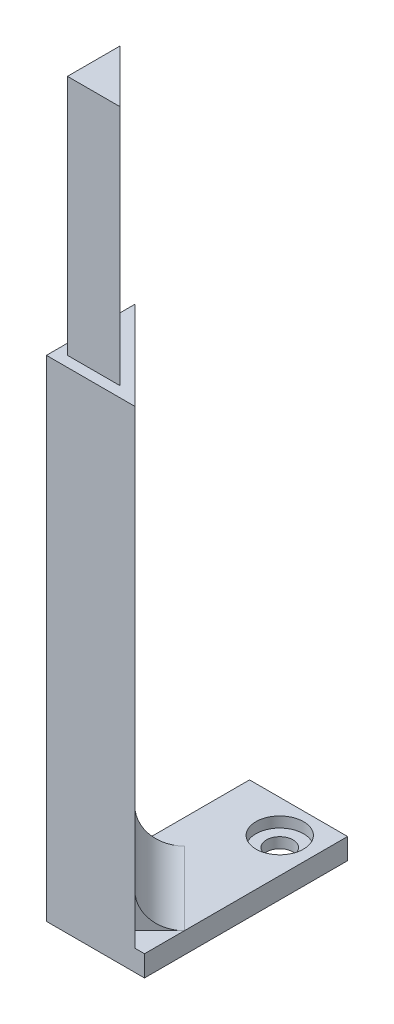
ISO-10303-21;
HEADER;
FILE_DESCRIPTION(('STEP AP214'),'2;1');
FILE_NAME('part.step','',(''),(''),'','','');
FILE_SCHEMA(('AUTOMOTIVE_DESIGN { 1 0 10303 214 1 1 1 1 }'));
ENDSEC;
DATA;
#1=APPLICATION_CONTEXT('core data for automotive mechanical design processes');
#2=APPLICATION_PROTOCOL_DEFINITION('international standard','automotive_design',2000,#1);
#3=PRODUCT_CONTEXT('',#1,'mechanical');
#4=PRODUCT('Part','Part','',(#3));
#5=PRODUCT_RELATED_PRODUCT_CATEGORY('part','',(#4));
#6=PRODUCT_DEFINITION_FORMATION('','',#4);
#7=PRODUCT_DEFINITION_CONTEXT('part definition',#1,'design');
#8=PRODUCT_DEFINITION('design','',#6,#7);
#9=PRODUCT_DEFINITION_SHAPE('','',#8);
#10=(LENGTH_UNIT() NAMED_UNIT(*) SI_UNIT(.MILLI.,.METRE.));
#11=(NAMED_UNIT(*) PLANE_ANGLE_UNIT() SI_UNIT($,.RADIAN.));
#12=(NAMED_UNIT(*) SI_UNIT($,.STERADIAN.) SOLID_ANGLE_UNIT());
#13=UNCERTAINTY_MEASURE_WITH_UNIT(LENGTH_MEASURE(1.E-05),#10,'distance_accuracy_value','');
#14=(GEOMETRIC_REPRESENTATION_CONTEXT(3) GLOBAL_UNCERTAINTY_ASSIGNED_CONTEXT((#13)) GLOBAL_UNIT_ASSIGNED_CONTEXT((#10,
#11,#12)) REPRESENTATION_CONTEXT('',''));
#15=CARTESIAN_POINT('',(0.,0.,0.));
#16=DIRECTION('',(0.,0.,1.));
#17=DIRECTION('',(1.,0.,0.));
#18=AXIS2_PLACEMENT_3D('',#15,#16,#17);
#19=CARTESIAN_POINT('',(15.04,6.,-45.59));
#20=DIRECTION('',(0.,-1.,0.));
#21=DIRECTION('',(0.,0.,-1.));
#22=AXIS2_PLACEMENT_3D('',#19,#20,#21);
#23=CYLINDRICAL_SURFACE('',#22,3.8);
#24=CARTESIAN_POINT('',(15.04,0.,-45.59));
#25=DIRECTION('',(0.,-1.,0.));
#26=DIRECTION('',(0.,0.,-1.));
#27=AXIS2_PLACEMENT_3D('',#24,#25,#26);
#28=CIRCLE('',#27,3.8);
#29=CARTESIAN_POINT('',(15.04,0.,-49.39));
#30=VERTEX_POINT('',#29);
#31=EDGE_CURVE('E179',#30,#30,#28,.T.);
#32=ORIENTED_EDGE('',*,*,#31,.T.);
#33=EDGE_LOOP('',(#32));
#34=FACE_BOUND('',#33,.T.);
#35=CARTESIAN_POINT('',(15.04,3.,-45.59));
#36=DIRECTION('',(0.,1.,0.));
#37=DIRECTION('',(0.,0.,1.));
#38=AXIS2_PLACEMENT_3D('',#35,#36,#37);
#39=CIRCLE('',#38,3.8);
#40=CARTESIAN_POINT('',(15.04,3.,-41.79));
#41=VERTEX_POINT('',#40);
#42=EDGE_CURVE('E44',#41,#41,#39,.F.);
#43=ORIENTED_EDGE('',*,*,#42,.F.);
#44=EDGE_LOOP('',(#43));
#45=FACE_BOUND('',#44,.T.);
#46=ADVANCED_FACE('F40',(#34,#45),#23,.F.);
#47=CARTESIAN_POINT('',(22.2426406871193,140.,3.));
#48=DIRECTION('',(0.707106781186547,0.,-0.707106781186547));
#49=DIRECTION('',(-0.707106781186548,0.,-0.707106781186548));
#50=AXIS2_PLACEMENT_3D('',#47,#48,#49);
#51=PLANE('',#50);
#52=DIRECTION('',(0.707106781186548,0.,0.707106781186548));
#53=VECTOR('',#52,1.);
#54=CARTESIAN_POINT('',(9.62132034355964,6.,-9.62132034355964));
#55=LINE('',#54,#53);
#56=CARTESIAN_POINT('',(17.9289321881345,6.,-1.31370849898476));
#57=VERTEX_POINT('',#56);
#58=CARTESIAN_POINT('',(22.2426406871193,6.,3.));
#59=VERTEX_POINT('',#58);
#60=EDGE_CURVE('E183',#57,#59,#55,.T.);
#61=ORIENTED_EDGE('',*,*,#60,.F.);
#62=DIRECTION('',(0.,-1.,0.));
#63=VECTOR('',#62,1.);
#64=CARTESIAN_POINT('',(17.9289321881345,16.,-1.31370849898476));
#65=LINE('',#64,#63);
#66=CARTESIAN_POINT('',(17.9289321881345,16.,-1.31370849898476));
#67=VERTEX_POINT('',#66);
#68=EDGE_CURVE('E165',#67,#57,#65,.T.);
#69=ORIENTED_EDGE('',*,*,#68,.F.);
#70=DIRECTION('',(0.707106781186548,0.,0.707106781186548));
#71=VECTOR('',#70,1.);
#72=CARTESIAN_POINT('',(17.9289321881345,16.,-1.31370849898476));
#73=LINE('',#72,#71);
#74=CARTESIAN_POINT('',(-3.,16.,-22.2426406871193));
#75=VERTEX_POINT('',#74);
#76=EDGE_CURVE('E131',#75,#67,#73,.T.);
#77=ORIENTED_EDGE('',*,*,#76,.F.);
#78=DIRECTION('',(0.,-1.,0.));
#79=VECTOR('',#78,1.);
#80=CARTESIAN_POINT('',(-3.,140.,-22.2426406871193));
#81=LINE('',#80,#79);
#82=CARTESIAN_POINT('',(-3.,140.,-22.2426406871193));
#83=VERTEX_POINT('',#82);
#84=EDGE_CURVE('E230',#83,#75,#81,.T.);
#85=ORIENTED_EDGE('',*,*,#84,.F.);
#86=DIRECTION('',(0.707106781186547,0.,0.707106781186547));
#87=VECTOR('',#86,1.);
#88=CARTESIAN_POINT('',(22.2426406871193,140.,3.));
#89=LINE('',#88,#87);
#90=CARTESIAN_POINT('',(22.2426406871193,140.,3.));
#91=VERTEX_POINT('',#90);
#92=EDGE_CURVE('E211',#83,#91,#89,.T.);
#93=ORIENTED_EDGE('',*,*,#92,.T.);
#94=DIRECTION('',(0.,-1.,0.));
#95=VECTOR('',#94,1.);
#96=CARTESIAN_POINT('',(22.2426406871193,140.,3.));
#97=LINE('',#96,#95);
#98=EDGE_CURVE('E224',#91,#59,#97,.T.);
#99=ORIENTED_EDGE('',*,*,#98,.T.);
#100=EDGE_LOOP('',(#61,#69,#77,#85,#93,#99));
#101=FACE_BOUND('',#100,.T.);
#102=ADVANCED_FACE('F295',(#101),#51,.T.);
#103=CARTESIAN_POINT('',(0.,6.,0.));
#104=DIRECTION('',(0.,-1.,0.));
#105=DIRECTION('',(0.,0.,-1.));
#106=AXIS2_PLACEMENT_3D('',#103,#104,#105);
#107=PLANE('',#106);
#108=DIRECTION('',(0.707106781186548,0.,-0.707106781186547));
#109=VECTOR('',#108,1.);
#110=CARTESIAN_POINT('',(25.,6.,-8.38477631085022));
#111=LINE('',#110,#109);
#112=CARTESIAN_POINT('',(25.,6.,-8.38477631085022));
#113=VERTEX_POINT('',#112);
#114=EDGE_CURVE('E65',#57,#113,#111,.T.);
#115=ORIENTED_EDGE('',*,*,#114,.F.);
#116=ORIENTED_EDGE('',*,*,#60,.T.);
#117=DIRECTION('',(-1.,0.,0.));
#118=VECTOR('',#117,1.);
#119=CARTESIAN_POINT('',(0.,6.,3.));
#120=LINE('',#119,#118);
#121=CARTESIAN_POINT('',(25.,6.,3.));
#122=VERTEX_POINT('',#121);
#123=EDGE_CURVE('E162',#122,#59,#120,.T.);
#124=ORIENTED_EDGE('',*,*,#123,.F.);
#125=DIRECTION('',(0.,0.,-1.));
#126=VECTOR('',#125,1.);
#127=CARTESIAN_POINT('',(25.,6.,0.));
#128=LINE('',#127,#126);
#129=EDGE_CURVE('E153',#122,#113,#128,.T.);
#130=ORIENTED_EDGE('',*,*,#129,.T.);
#131=EDGE_LOOP('',(#115,#116,#124,#130));
#132=FACE_BOUND('',#131,.T.);
#133=ADVANCED_FACE('F160',(#132),#107,.F.);
#134=CARTESIAN_POINT('',(15.04,6.,-45.59));
#135=DIRECTION('',(0.,1.,0.));
#136=DIRECTION('',(0.,0.,1.));
#137=AXIS2_PLACEMENT_3D('',#134,#135,#136);
#138=CIRCLE('',#137,6.8);
#139=CARTESIAN_POINT('',(15.04,6.,-38.79));
#140=VERTEX_POINT('',#139);
#141=EDGE_CURVE('E458',#140,#140,#138,.T.);
#142=ORIENTED_EDGE('',*,*,#141,.F.);
#143=EDGE_LOOP('',(#142));
#144=FACE_BOUND('',#143,.T.);
#145=DIRECTION('',(1.,0.,0.));
#146=VECTOR('',#145,1.);
#147=CARTESIAN_POINT('',(0.,6.,-55.));
#148=LINE('',#147,#146);
#149=CARTESIAN_POINT('',(-3.,6.,-55.));
#150=VERTEX_POINT('',#149);
#151=CARTESIAN_POINT('',(25.,6.,-55.));
#152=VERTEX_POINT('',#151);
#153=EDGE_CURVE('E189',#150,#152,#148,.T.);
#154=ORIENTED_EDGE('',*,*,#153,.F.);
#155=DIRECTION('',(0.,0.,-1.));
#156=VECTOR('',#155,1.);
#157=CARTESIAN_POINT('',(-3.,6.,0.));
#158=LINE('',#157,#156);
#159=CARTESIAN_POINT('',(-3.,6.,-22.2426406871193));
#160=VERTEX_POINT('',#159);
#161=EDGE_CURVE('E186',#160,#150,#158,.T.);
#162=ORIENTED_EDGE('',*,*,#161,.F.);
#163=DIRECTION('',(-0.707106781186548,0.,0.707106781186547));
#164=VECTOR('',#163,1.);
#165=CARTESIAN_POINT('',(-3.,6.,-22.2426406871193));
#166=LINE('',#165,#164);
#167=CARTESIAN_POINT('',(4.07106781186549,6.,-29.3137084989848));
#168=VERTEX_POINT('',#167);
#169=EDGE_CURVE('E145',#168,#160,#166,.T.);
#170=ORIENTED_EDGE('',*,*,#169,.F.);
#171=DIRECTION('',(-0.707106781186547,0.,-0.707106781186548));
#172=VECTOR('',#171,1.);
#173=CARTESIAN_POINT('',(4.07106781186548,6.,-29.3137084989848));
#174=LINE('',#173,#172);
#175=EDGE_CURVE('E130',#113,#168,#174,.T.);
#176=ORIENTED_EDGE('',*,*,#175,.F.);
#177=EDGE_CURVE('E142',#113,#152,#128,.T.);
#178=ORIENTED_EDGE('',*,*,#177,.T.);
#179=EDGE_LOOP('',(#154,#162,#170,#176,#178));
#180=FACE_BOUND('',#179,.T.);
#181=ADVANCED_FACE('F141',(#144,#180),#107,.F.);
#182=CARTESIAN_POINT('',(0.,320.,0.));
#183=DIRECTION('',(0.,0.,-1.));
#184=DIRECTION('',(-1.,0.,0.));
#185=AXIS2_PLACEMENT_3D('',#182,#183,#184);
#186=PLANE('',#185);
#187=DIRECTION('',(0.,-1.,0.));
#188=VECTOR('',#187,1.);
#189=CARTESIAN_POINT('',(0.,320.,0.));
#190=LINE('',#189,#188);
#191=CARTESIAN_POINT('',(0.,209.,0.));
#192=VERTEX_POINT('',#191);
#193=CARTESIAN_POINT('',(0.,140.,0.));
#194=VERTEX_POINT('',#193);
#195=EDGE_CURVE('E258',#192,#194,#190,.T.);
#196=ORIENTED_EDGE('',*,*,#195,.T.);
#197=DIRECTION('',(1.,0.,0.));
#198=VECTOR('',#197,1.);
#199=CARTESIAN_POINT('',(0.,140.,0.));
#200=LINE('',#199,#198);
#201=CARTESIAN_POINT('',(15.,140.,0.));
#202=VERTEX_POINT('',#201);
#203=EDGE_CURVE('E244',#194,#202,#200,.T.);
#204=ORIENTED_EDGE('',*,*,#203,.T.);
#205=DIRECTION('',(0.,-1.,0.));
#206=VECTOR('',#205,1.);
#207=CARTESIAN_POINT('',(15.,320.,0.));
#208=LINE('',#207,#206);
#209=CARTESIAN_POINT('',(15.,209.,0.));
#210=VERTEX_POINT('',#209);
#211=EDGE_CURVE('E50',#210,#202,#208,.T.);
#212=ORIENTED_EDGE('',*,*,#211,.F.);
#213=DIRECTION('',(1.,0.,0.));
#214=VECTOR('',#213,1.);
#215=CARTESIAN_POINT('',(15.,209.,0.));
#216=LINE('',#215,#214);
#217=EDGE_CURVE('E248',#192,#210,#216,.T.);
#218=ORIENTED_EDGE('',*,*,#217,.F.);
#219=EDGE_LOOP('',(#196,#204,#212,#218));
#220=FACE_BOUND('',#219,.T.);
#221=ADVANCED_FACE('F42',(#220),#186,.F.);
#222=CARTESIAN_POINT('',(0.,320.,-15.));
#223=DIRECTION('',(-0.707106781186548,0.,0.707106781186548));
#224=DIRECTION('',(0.707106781186548,0.,0.707106781186548));
#225=AXIS2_PLACEMENT_3D('',#222,#223,#224);
#226=PLANE('',#225);
#227=ORIENTED_EDGE('',*,*,#211,.T.);
#228=DIRECTION('',(-0.707106781186548,0.,-0.707106781186548));
#229=VECTOR('',#228,1.);
#230=CARTESIAN_POINT('',(0.,140.,-15.));
#231=LINE('',#230,#229);
#232=CARTESIAN_POINT('',(0.,140.,-15.));
#233=VERTEX_POINT('',#232);
#234=EDGE_CURVE('E234',#202,#233,#231,.T.);
#235=ORIENTED_EDGE('',*,*,#234,.T.);
#236=DIRECTION('',(0.,-1.,0.));
#237=VECTOR('',#236,1.);
#238=CARTESIAN_POINT('',(0.,320.,-15.));
#239=LINE('',#238,#237);
#240=CARTESIAN_POINT('',(0.,209.,-15.));
#241=VERTEX_POINT('',#240);
#242=EDGE_CURVE('E262',#241,#233,#239,.T.);
#243=ORIENTED_EDGE('',*,*,#242,.F.);
#244=DIRECTION('',(0.707106781186548,0.,0.707106781186548));
#245=VECTOR('',#244,1.);
#246=CARTESIAN_POINT('',(0.,209.,-15.));
#247=LINE('',#246,#245);
#248=EDGE_CURVE('E254',#241,#210,#247,.T.);
#249=ORIENTED_EDGE('',*,*,#248,.T.);
#250=EDGE_LOOP('',(#227,#235,#243,#249));
#251=FACE_BOUND('',#250,.T.);
#252=ADVANCED_FACE('F270',(#251),#226,.F.);
#253=CARTESIAN_POINT('',(0.,320.,0.));
#254=DIRECTION('',(1.,0.,0.));
#255=DIRECTION('',(0.,0.,-1.));
#256=AXIS2_PLACEMENT_3D('',#253,#254,#255);
#257=PLANE('',#256);
#258=ORIENTED_EDGE('',*,*,#242,.T.);
#259=DIRECTION('',(0.,0.,1.));
#260=VECTOR('',#259,1.);
#261=CARTESIAN_POINT('',(0.,140.,0.));
#262=LINE('',#261,#260);
#263=EDGE_CURVE('E11',#233,#194,#262,.T.);
#264=ORIENTED_EDGE('',*,*,#263,.T.);
#265=ORIENTED_EDGE('',*,*,#195,.F.);
#266=DIRECTION('',(0.,0.,1.));
#267=VECTOR('',#266,1.);
#268=CARTESIAN_POINT('',(0.,209.,-15.));
#269=LINE('',#268,#267);
#270=EDGE_CURVE('E251',#241,#192,#269,.T.);
#271=ORIENTED_EDGE('',*,*,#270,.F.);
#272=EDGE_LOOP('',(#258,#264,#265,#271));
#273=FACE_BOUND('',#272,.T.);
#274=ADVANCED_FACE('F278',(#273),#257,.F.);
#275=CARTESIAN_POINT('',(15.,209.,-15.));
#276=DIRECTION('',(0.,-1.,0.));
#277=DIRECTION('',(0.,0.,-1.));
#278=AXIS2_PLACEMENT_3D('',#275,#276,#277);
#279=PLANE('',#278);
#280=ORIENTED_EDGE('',*,*,#270,.T.);
#281=ORIENTED_EDGE('',*,*,#217,.T.);
#282=ORIENTED_EDGE('',*,*,#248,.F.);
#283=EDGE_LOOP('',(#280,#281,#282));
#284=FACE_BOUND('',#283,.T.);
#285=ADVANCED_FACE('F281',(#284),#279,.F.);
#286=CARTESIAN_POINT('',(0.,140.,0.));
#287=DIRECTION('',(0.,1.,0.));
#288=DIRECTION('',(0.,0.,1.));
#289=AXIS2_PLACEMENT_3D('',#286,#287,#288);
#290=PLANE('',#289);
#291=ORIENTED_EDGE('',*,*,#92,.F.);
#292=DIRECTION('',(0.,0.,-1.));
#293=VECTOR('',#292,1.);
#294=CARTESIAN_POINT('',(-3.,140.,-22.2426406871193));
#295=LINE('',#294,#293);
#296=CARTESIAN_POINT('',(-3.,140.,3.));
#297=VERTEX_POINT('',#296);
#298=EDGE_CURVE('E220',#297,#83,#295,.T.);
#299=ORIENTED_EDGE('',*,*,#298,.F.);
#300=DIRECTION('',(-1.,0.,0.));
#301=VECTOR('',#300,1.);
#302=CARTESIAN_POINT('',(-3.,140.,3.));
#303=LINE('',#302,#301);
#304=EDGE_CURVE('E215',#91,#297,#303,.T.);
#305=ORIENTED_EDGE('',*,*,#304,.F.);
#306=EDGE_LOOP('',(#291,#299,#305));
#307=FACE_BOUND('',#306,.T.);
#308=ORIENTED_EDGE('',*,*,#203,.F.);
#309=ORIENTED_EDGE('',*,*,#263,.F.);
#310=ORIENTED_EDGE('',*,*,#234,.F.);
#311=EDGE_LOOP('',(#308,#309,#310));
#312=FACE_BOUND('',#311,.T.);
#313=ADVANCED_FACE('F276',(#307,#312),#290,.T.);
#314=CARTESIAN_POINT('',(-3.,140.,-22.2426406871193));
#315=DIRECTION('',(-1.,0.,0.));
#316=DIRECTION('',(0.,0.,1.));
#317=AXIS2_PLACEMENT_3D('',#314,#315,#316);
#318=PLANE('',#317);
#319=DIRECTION('',(0.,0.,-1.));
#320=VECTOR('',#319,1.);
#321=CARTESIAN_POINT('',(-3.,0.,-22.2426406871193));
#322=LINE('',#321,#320);
#323=CARTESIAN_POINT('',(-3.,0.,3.));
#324=VERTEX_POINT('',#323);
#325=CARTESIAN_POINT('',(-3.,0.,-55.));
#326=VERTEX_POINT('',#325);
#327=EDGE_CURVE('E216',#324,#326,#322,.T.);
#328=ORIENTED_EDGE('',*,*,#327,.F.);
#329=DIRECTION('',(0.,-1.,0.));
#330=VECTOR('',#329,1.);
#331=CARTESIAN_POINT('',(-3.,140.,3.));
#332=LINE('',#331,#330);
#333=EDGE_CURVE('E235',#297,#324,#332,.T.);
#334=ORIENTED_EDGE('',*,*,#333,.F.);
#335=ORIENTED_EDGE('',*,*,#298,.T.);
#336=ORIENTED_EDGE('',*,*,#84,.T.);
#337=DIRECTION('',(0.,-1.,0.));
#338=VECTOR('',#337,1.);
#339=CARTESIAN_POINT('',(-3.,16.,-22.2426406871193));
#340=LINE('',#339,#338);
#341=EDGE_CURVE('E174',#75,#160,#340,.T.);
#342=ORIENTED_EDGE('',*,*,#341,.T.);
#343=ORIENTED_EDGE('',*,*,#161,.T.);
#344=DIRECTION('',(0.,-1.,0.));
#345=VECTOR('',#344,1.);
#346=CARTESIAN_POINT('',(-3.,6.,-55.));
#347=LINE('',#346,#345);
#348=EDGE_CURVE('E205',#150,#326,#347,.T.);
#349=ORIENTED_EDGE('',*,*,#348,.T.);
#350=EDGE_LOOP('',(#328,#334,#335,#336,#342,#343,#349));
#351=FACE_BOUND('',#350,.T.);
#352=ADVANCED_FACE('F288',(#351),#318,.T.);
#353=CARTESIAN_POINT('',(-3.,140.,3.));
#354=DIRECTION('',(0.,0.,1.));
#355=DIRECTION('',(1.,0.,0.));
#356=AXIS2_PLACEMENT_3D('',#353,#354,#355);
#357=PLANE('',#356);
#358=DIRECTION('',(-1.,0.,0.));
#359=VECTOR('',#358,1.);
#360=CARTESIAN_POINT('',(-3.,0.,3.));
#361=LINE('',#360,#359);
#362=CARTESIAN_POINT('',(25.,0.,3.));
#363=VERTEX_POINT('',#362);
#364=EDGE_CURVE('E204',#363,#324,#361,.T.);
#365=ORIENTED_EDGE('',*,*,#364,.F.);
#366=DIRECTION('',(0.,-1.,0.));
#367=VECTOR('',#366,1.);
#368=CARTESIAN_POINT('',(25.,6.,3.));
#369=LINE('',#368,#367);
#370=EDGE_CURVE('E192',#122,#363,#369,.T.);
#371=ORIENTED_EDGE('',*,*,#370,.F.);
#372=ORIENTED_EDGE('',*,*,#123,.T.);
#373=ORIENTED_EDGE('',*,*,#98,.F.);
#374=ORIENTED_EDGE('',*,*,#304,.T.);
#375=ORIENTED_EDGE('',*,*,#333,.T.);
#376=EDGE_LOOP('',(#365,#371,#372,#373,#374,#375));
#377=FACE_BOUND('',#376,.T.);
#378=ADVANCED_FACE('F310',(#377),#357,.T.);
#379=CARTESIAN_POINT('',(0.,0.,0.));
#380=DIRECTION('',(0.,1.,0.));
#381=DIRECTION('',(0.,0.,1.));
#382=AXIS2_PLACEMENT_3D('',#379,#380,#381);
#383=PLANE('',#382);
#384=ORIENTED_EDGE('',*,*,#327,.T.);
#385=DIRECTION('',(1.,0.,0.));
#386=VECTOR('',#385,1.);
#387=CARTESIAN_POINT('',(0.,0.,-55.));
#388=LINE('',#387,#386);
#389=CARTESIAN_POINT('',(25.,0.,-55.));
#390=VERTEX_POINT('',#389);
#391=EDGE_CURVE('E158',#326,#390,#388,.T.);
#392=ORIENTED_EDGE('',*,*,#391,.T.);
#393=DIRECTION('',(0.,0.,-1.));
#394=VECTOR('',#393,1.);
#395=CARTESIAN_POINT('',(25.,0.,0.));
#396=LINE('',#395,#394);
#397=EDGE_CURVE('E196',#363,#390,#396,.T.);
#398=ORIENTED_EDGE('',*,*,#397,.F.);
#399=ORIENTED_EDGE('',*,*,#364,.T.);
#400=EDGE_LOOP('',(#384,#392,#398,#399));
#401=FACE_BOUND('',#400,.T.);
#402=ORIENTED_EDGE('',*,*,#31,.F.);
#403=EDGE_LOOP('',(#402));
#404=FACE_BOUND('',#403,.T.);
#405=ADVANCED_FACE('F313',(#401,#404),#383,.F.);
#406=CARTESIAN_POINT('',(25.,6.,0.));
#407=DIRECTION('',(-1.,0.,0.));
#408=DIRECTION('',(0.,0.,1.));
#409=AXIS2_PLACEMENT_3D('',#406,#407,#408);
#410=PLANE('',#409);
#411=ORIENTED_EDGE('',*,*,#397,.T.);
#412=DIRECTION('',(0.,-1.,0.));
#413=VECTOR('',#412,1.);
#414=CARTESIAN_POINT('',(25.,6.,-55.));
#415=LINE('',#414,#413);
#416=EDGE_CURVE('E155',#152,#390,#415,.T.);
#417=ORIENTED_EDGE('',*,*,#416,.F.);
#418=ORIENTED_EDGE('',*,*,#177,.F.);
#419=ORIENTED_EDGE('',*,*,#129,.F.);
#420=ORIENTED_EDGE('',*,*,#370,.T.);
#421=EDGE_LOOP('',(#411,#417,#418,#419,#420));
#422=FACE_BOUND('',#421,.T.);
#423=ADVANCED_FACE('F151',(#422),#410,.F.);
#424=CARTESIAN_POINT('',(0.,6.,-55.));
#425=DIRECTION('',(0.,0.,-1.));
#426=DIRECTION('',(-1.,0.,0.));
#427=AXIS2_PLACEMENT_3D('',#424,#425,#426);
#428=PLANE('',#427);
#429=ORIENTED_EDGE('',*,*,#391,.F.);
#430=ORIENTED_EDGE('',*,*,#348,.F.);
#431=ORIENTED_EDGE('',*,*,#153,.T.);
#432=ORIENTED_EDGE('',*,*,#416,.T.);
#433=EDGE_LOOP('',(#429,#430,#431,#432));
#434=FACE_BOUND('',#433,.T.);
#435=ADVANCED_FACE('F325',(#434),#428,.T.);
#436=CARTESIAN_POINT('',(25.,16.,-8.38477631085022));
#437=DIRECTION('',(-0.707106781186547,0.,-0.707106781186548));
#438=DIRECTION('',(-0.707106781186548,0.,0.707106781186547));
#439=AXIS2_PLACEMENT_3D('',#436,#437,#438);
#440=PLANE('',#439);
#441=ORIENTED_EDGE('',*,*,#114,.T.);
#442=CARTESIAN_POINT('',(25.,16.,-8.38477631085023));
#443=DIRECTION('',(0.707106781186547,0.,0.707106781186548));
#444=DIRECTION('',(0.707106781186548,0.,-0.707106781186547));
#445=AXIS2_PLACEMENT_3D('',#442,#443,#444);
#446=CIRCLE('',#445,10.);
#447=EDGE_CURVE('E127',#67,#113,#446,.T.);
#448=ORIENTED_EDGE('',*,*,#447,.F.);
#449=ORIENTED_EDGE('',*,*,#68,.T.);
#450=EDGE_LOOP('',(#441,#448,#449));
#451=FACE_BOUND('',#450,.T.);
#452=ADVANCED_FACE('F164',(#451),#440,.F.);
#453=CARTESIAN_POINT('',(-3.,16.,-22.2426406871193));
#454=DIRECTION('',(0.707106781186547,0.,0.707106781186548));
#455=DIRECTION('',(0.707106781186548,0.,-0.707106781186547));
#456=AXIS2_PLACEMENT_3D('',#453,#454,#455);
#457=PLANE('',#456);
#458=ORIENTED_EDGE('',*,*,#341,.F.);
#459=CARTESIAN_POINT('',(4.07106781186549,16.,-29.3137084989848));
#460=DIRECTION('',(0.707106781186547,0.,0.707106781186548));
#461=DIRECTION('',(0.707106781186548,0.,-0.707106781186547));
#462=AXIS2_PLACEMENT_3D('',#459,#460,#461);
#463=CIRCLE('',#462,10.);
#464=EDGE_CURVE('E57',#75,#168,#463,.T.);
#465=ORIENTED_EDGE('',*,*,#464,.T.);
#466=ORIENTED_EDGE('',*,*,#169,.T.);
#467=EDGE_LOOP('',(#458,#465,#466));
#468=FACE_BOUND('',#467,.T.);
#469=ADVANCED_FACE('F328',(#468),#457,.F.);
#470=CARTESIAN_POINT('',(-12.3076118445749,16.,-45.6923881554251));
#471=DIRECTION('',(0.707106781186547,0.,0.707106781186548));
#472=DIRECTION('',(0.707106781186548,0.,-0.707106781186547));
#473=AXIS2_PLACEMENT_3D('',#470,#471,#472);
#474=CYLINDRICAL_SURFACE('',#473,10.);
#475=ORIENTED_EDGE('',*,*,#76,.T.);
#476=ORIENTED_EDGE('',*,*,#447,.T.);
#477=ORIENTED_EDGE('',*,*,#175,.T.);
#478=ORIENTED_EDGE('',*,*,#464,.F.);
#479=EDGE_LOOP('',(#475,#476,#477,#478));
#480=FACE_BOUND('',#479,.T.);
#481=ADVANCED_FACE('F129',(#480),#474,.F.);
#482=CARTESIAN_POINT('',(15.04,3.,-45.59));
#483=DIRECTION('',(0.,1.,0.));
#484=DIRECTION('',(0.,0.,1.));
#485=AXIS2_PLACEMENT_3D('',#482,#483,#484);
#486=PLANE('',#485);
#487=CARTESIAN_POINT('',(15.04,3.,-45.59));
#488=DIRECTION('',(0.,1.,0.));
#489=DIRECTION('',(0.,0.,1.));
#490=AXIS2_PLACEMENT_3D('',#487,#488,#489);
#491=CIRCLE('',#490,6.8);
#492=CARTESIAN_POINT('',(15.04,3.,-38.79));
#493=VERTEX_POINT('',#492);
#494=EDGE_CURVE('E455',#493,#493,#491,.T.);
#495=ORIENTED_EDGE('',*,*,#494,.T.);
#496=EDGE_LOOP('',(#495));
#497=FACE_BOUND('',#496,.T.);
#498=ORIENTED_EDGE('',*,*,#42,.T.);
#499=EDGE_LOOP('',(#498));
#500=FACE_BOUND('',#499,.T.);
#501=ADVANCED_FACE('F335',(#497,#500),#486,.T.);
#502=CARTESIAN_POINT('',(15.04,3.,-45.59));
#503=DIRECTION('',(0.,1.,0.));
#504=DIRECTION('',(0.,0.,1.));
#505=AXIS2_PLACEMENT_3D('',#502,#503,#504);
#506=CYLINDRICAL_SURFACE('',#505,6.8);
#507=ORIENTED_EDGE('',*,*,#494,.F.);
#508=EDGE_LOOP('',(#507));
#509=FACE_BOUND('',#508,.T.);
#510=ORIENTED_EDGE('',*,*,#141,.T.);
#511=EDGE_LOOP('',(#510));
#512=FACE_BOUND('',#511,.T.);
#513=ADVANCED_FACE('F438',(#509,#512),#506,.F.);
#514=CLOSED_SHELL('',(#46,#102,#133,#181,#221,#252,#274,#285,#313,#352,#378,#405,#423,#435,#452,
#469,#481,#501,#513));
#515=MANIFOLD_SOLID_BREP('B2',#514);
#516=ADVANCED_BREP_SHAPE_REPRESENTATION('',(#18,#515),#14);
#517=SHAPE_DEFINITION_REPRESENTATION(#9,#516);
ENDSEC;
END-ISO-10303-21;
